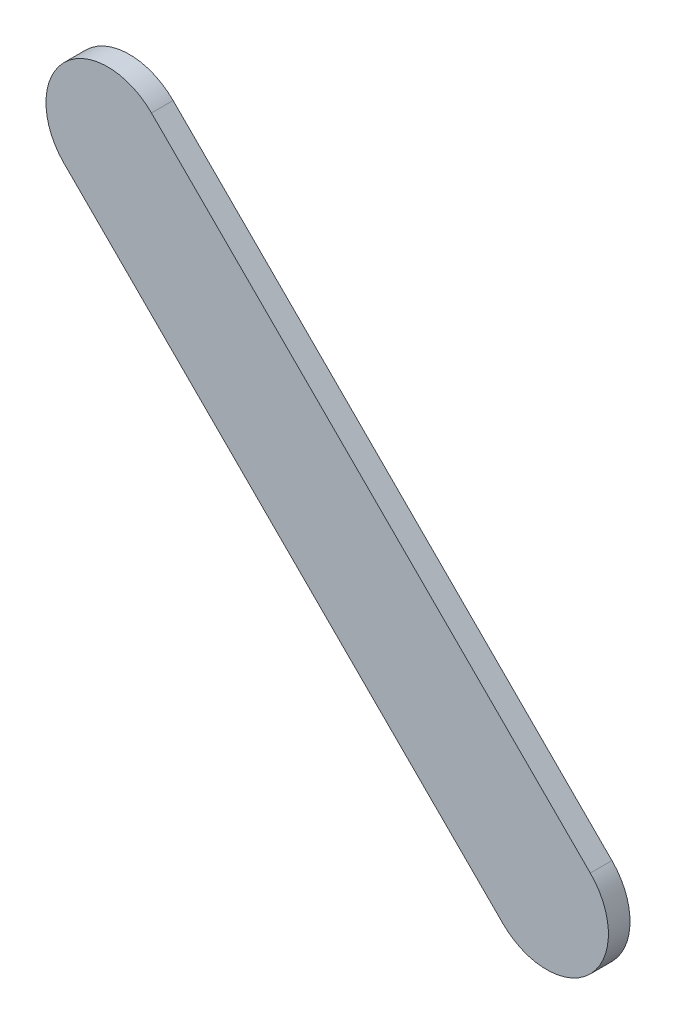
ISO-10303-21;
HEADER;
FILE_DESCRIPTION(('STEP AP214'),'2;1');
FILE_NAME('part.step','',(''),(''),'','','');
FILE_SCHEMA(('AUTOMOTIVE_DESIGN { 1 0 10303 214 1 1 1 1 }'));
ENDSEC;
DATA;
#1=APPLICATION_CONTEXT('core data for automotive mechanical design processes');
#2=APPLICATION_PROTOCOL_DEFINITION('international standard','automotive_design',2000,#1);
#3=PRODUCT_CONTEXT('',#1,'mechanical');
#4=PRODUCT('Part','Part','',(#3));
#5=PRODUCT_RELATED_PRODUCT_CATEGORY('part','',(#4));
#6=PRODUCT_DEFINITION_FORMATION('','',#4);
#7=PRODUCT_DEFINITION_CONTEXT('part definition',#1,'design');
#8=PRODUCT_DEFINITION('design','',#6,#7);
#9=PRODUCT_DEFINITION_SHAPE('','',#8);
#10=(LENGTH_UNIT() NAMED_UNIT(*) SI_UNIT(.MILLI.,.METRE.));
#11=(NAMED_UNIT(*) PLANE_ANGLE_UNIT() SI_UNIT($,.RADIAN.));
#12=(NAMED_UNIT(*) SI_UNIT($,.STERADIAN.) SOLID_ANGLE_UNIT());
#13=UNCERTAINTY_MEASURE_WITH_UNIT(LENGTH_MEASURE(1.E-05),#10,'distance_accuracy_value','');
#14=(GEOMETRIC_REPRESENTATION_CONTEXT(3) GLOBAL_UNCERTAINTY_ASSIGNED_CONTEXT((#13)) GLOBAL_UNIT_ASSIGNED_CONTEXT((#10,
#11,#12)) REPRESENTATION_CONTEXT('',''));
#15=CARTESIAN_POINT('',(0.,0.,0.));
#16=DIRECTION('',(0.,0.,1.));
#17=DIRECTION('',(1.,0.,0.));
#18=AXIS2_PLACEMENT_3D('',#15,#16,#17);
#19=CARTESIAN_POINT('',(80.069289,-109.76071,1.635));
#20=DIRECTION('',(0.,0.,1.));
#21=DIRECTION('',(1.,0.,0.));
#22=AXIS2_PLACEMENT_3D('',#19,#20,#21);
#23=PLANE('',#22);
#24=DIRECTION('',(0.707106781186548,-0.707106781186548,0.));
#25=VECTOR('',#24,1.);
#26=CARTESIAN_POINT('',(80.069289,-109.76071,1.635));
#27=LINE('',#26,#25);
#28=CARTESIAN_POINT('',(80.069289,-109.76071,1.635));
#29=VERTEX_POINT('',#28);
#30=CARTESIAN_POINT('',(80.779289,-110.47071,1.635));
#31=VERTEX_POINT('',#30);
#32=EDGE_CURVE('E69',#29,#31,#27,.T.);
#33=ORIENTED_EDGE('',*,*,#32,.T.);
#34=CARTESIAN_POINT('',(80.8499995,-110.3999995,1.635));
#35=DIRECTION('',(0.,0.,1.));
#36=DIRECTION('',(-0.707106781186548,-0.707106781186548,0.));
#37=AXIS2_PLACEMENT_3D('',#34,#35,#36);
#38=CIRCLE('',#37,0.09999974810218);
#39=CARTESIAN_POINT('',(80.92071,-110.329289,1.635));
#40=VERTEX_POINT('',#39);
#41=EDGE_CURVE('E94',#31,#40,#38,.T.);
#42=ORIENTED_EDGE('',*,*,#41,.T.);
#43=DIRECTION('',(-0.707106781186548,0.707106781186548,0.));
#44=VECTOR('',#43,1.);
#45=CARTESIAN_POINT('',(80.92071,-110.329289,1.635));
#46=LINE('',#45,#44);
#47=CARTESIAN_POINT('',(80.21071,-109.619289,1.635));
#48=VERTEX_POINT('',#47);
#49=EDGE_CURVE('E71',#40,#48,#46,.T.);
#50=ORIENTED_EDGE('',*,*,#49,.T.);
#51=CARTESIAN_POINT('',(80.1399995,-109.6899995,1.635));
#52=DIRECTION('',(0.,0.,1.));
#53=DIRECTION('',(0.707106781186548,0.707106781186548,0.));
#54=AXIS2_PLACEMENT_3D('',#51,#52,#53);
#55=CIRCLE('',#54,0.09999974810219);
#56=EDGE_CURVE('E11',#48,#29,#55,.T.);
#57=ORIENTED_EDGE('',*,*,#56,.T.);
#58=EDGE_LOOP('',(#33,#42,#50,#57));
#59=FACE_BOUND('',#58,.T.);
#60=ADVANCED_FACE('F17',(#59),#23,.T.);
#61=CARTESIAN_POINT('',(80.069289,-109.76071,1.6));
#62=DIRECTION('',(0.,0.,1.));
#63=DIRECTION('',(1.,0.,0.));
#64=AXIS2_PLACEMENT_3D('',#61,#62,#63);
#65=PLANE('',#64);
#66=CARTESIAN_POINT('',(80.1399995,-109.6899995,1.6));
#67=DIRECTION('',(0.,0.,1.));
#68=DIRECTION('',(0.707106781186548,0.707106781186548,0.));
#69=AXIS2_PLACEMENT_3D('',#66,#67,#68);
#70=CIRCLE('',#69,0.09999974810219);
#71=CARTESIAN_POINT('',(80.21071,-109.619289,1.6));
#72=VERTEX_POINT('',#71);
#73=CARTESIAN_POINT('',(80.069289,-109.76071,1.6));
#74=VERTEX_POINT('',#73);
#75=EDGE_CURVE('E25',#72,#74,#70,.T.);
#76=ORIENTED_EDGE('',*,*,#75,.F.);
#77=DIRECTION('',(-0.707106781186548,0.707106781186548,0.));
#78=VECTOR('',#77,1.);
#79=CARTESIAN_POINT('',(80.92071,-110.329289,1.6));
#80=LINE('',#79,#78);
#81=CARTESIAN_POINT('',(80.92071,-110.329289,1.6));
#82=VERTEX_POINT('',#81);
#83=EDGE_CURVE('E102',#82,#72,#80,.T.);
#84=ORIENTED_EDGE('',*,*,#83,.F.);
#85=CARTESIAN_POINT('',(80.8499995,-110.3999995,1.6));
#86=DIRECTION('',(0.,0.,1.));
#87=DIRECTION('',(-0.707106781186548,-0.707106781186548,0.));
#88=AXIS2_PLACEMENT_3D('',#85,#86,#87);
#89=CIRCLE('',#88,0.09999974810218);
#90=CARTESIAN_POINT('',(80.779289,-110.47071,1.6));
#91=VERTEX_POINT('',#90);
#92=EDGE_CURVE('E79',#91,#82,#89,.T.);
#93=ORIENTED_EDGE('',*,*,#92,.F.);
#94=DIRECTION('',(0.707106781186548,-0.707106781186548,0.));
#95=VECTOR('',#94,1.);
#96=CARTESIAN_POINT('',(80.069289,-109.76071,1.6));
#97=LINE('',#96,#95);
#98=EDGE_CURVE('E90',#74,#91,#97,.T.);
#99=ORIENTED_EDGE('',*,*,#98,.F.);
#100=EDGE_LOOP('',(#76,#84,#93,#99));
#101=FACE_BOUND('',#100,.T.);
#102=ADVANCED_FACE('F119',(#101),#65,.F.);
#103=CARTESIAN_POINT('',(80.1399995,-109.6899995,1.6));
#104=DIRECTION('',(0.,0.,-1.));
#105=DIRECTION('',(0.707106781186548,0.707106781186548,0.));
#106=AXIS2_PLACEMENT_3D('',#103,#104,#105);
#107=CYLINDRICAL_SURFACE('',#106,0.09999974810219);
#108=ORIENTED_EDGE('',*,*,#75,.T.);
#109=DIRECTION('',(0.,0.,1.));
#110=VECTOR('',#109,1.);
#111=CARTESIAN_POINT('',(80.069289,-109.76071,1.6));
#112=LINE('',#111,#110);
#113=EDGE_CURVE('E74',#74,#29,#112,.T.);
#114=ORIENTED_EDGE('',*,*,#113,.T.);
#115=ORIENTED_EDGE('',*,*,#56,.F.);
#116=DIRECTION('',(0.,0.,1.));
#117=VECTOR('',#116,1.);
#118=CARTESIAN_POINT('',(80.21071,-109.619289,1.6));
#119=LINE('',#118,#117);
#120=EDGE_CURVE('E106',#72,#48,#119,.T.);
#121=ORIENTED_EDGE('',*,*,#120,.F.);
#122=EDGE_LOOP('',(#108,#114,#115,#121));
#123=FACE_BOUND('',#122,.T.);
#124=ADVANCED_FACE('F75',(#123),#107,.T.);
#125=CARTESIAN_POINT('',(80.92071,-110.329289,1.6));
#126=DIRECTION('',(-0.707106781186548,-0.707106781186548,0.));
#127=DIRECTION('',(-0.707106781186548,0.707106781186548,0.));
#128=AXIS2_PLACEMENT_3D('',#125,#126,#127);
#129=PLANE('',#128);
#130=ORIENTED_EDGE('',*,*,#83,.T.);
#131=ORIENTED_EDGE('',*,*,#120,.T.);
#132=ORIENTED_EDGE('',*,*,#49,.F.);
#133=DIRECTION('',(0.,0.,1.));
#134=VECTOR('',#133,1.);
#135=CARTESIAN_POINT('',(80.92071,-110.329289,1.6));
#136=LINE('',#135,#134);
#137=EDGE_CURVE('E98',#82,#40,#136,.T.);
#138=ORIENTED_EDGE('',*,*,#137,.F.);
#139=EDGE_LOOP('',(#130,#131,#132,#138));
#140=FACE_BOUND('',#139,.T.);
#141=ADVANCED_FACE('F176',(#140),#129,.F.);
#142=CARTESIAN_POINT('',(80.8499995,-110.3999995,1.6));
#143=DIRECTION('',(0.,0.,-1.));
#144=DIRECTION('',(-0.707106781186548,-0.707106781186548,0.));
#145=AXIS2_PLACEMENT_3D('',#142,#143,#144);
#146=CYLINDRICAL_SURFACE('',#145,0.09999974810218);
#147=ORIENTED_EDGE('',*,*,#92,.T.);
#148=ORIENTED_EDGE('',*,*,#137,.T.);
#149=ORIENTED_EDGE('',*,*,#41,.F.);
#150=DIRECTION('',(0.,0.,1.));
#151=VECTOR('',#150,1.);
#152=CARTESIAN_POINT('',(80.779289,-110.47071,1.6));
#153=LINE('',#152,#151);
#154=EDGE_CURVE('E83',#91,#31,#153,.T.);
#155=ORIENTED_EDGE('',*,*,#154,.F.);
#156=EDGE_LOOP('',(#147,#148,#149,#155));
#157=FACE_BOUND('',#156,.T.);
#158=ADVANCED_FACE('F122',(#157),#146,.T.);
#159=CARTESIAN_POINT('',(80.069289,-109.76071,1.6));
#160=DIRECTION('',(0.707106781186548,0.707106781186548,0.));
#161=DIRECTION('',(0.,0.,-1.));
#162=AXIS2_PLACEMENT_3D('',#159,#160,#161);
#163=PLANE('',#162);
#164=ORIENTED_EDGE('',*,*,#98,.T.);
#165=ORIENTED_EDGE('',*,*,#154,.T.);
#166=ORIENTED_EDGE('',*,*,#32,.F.);
#167=ORIENTED_EDGE('',*,*,#113,.F.);
#168=EDGE_LOOP('',(#164,#165,#166,#167));
#169=FACE_BOUND('',#168,.T.);
#170=ADVANCED_FACE('F81',(#169),#163,.F.);
#171=CLOSED_SHELL('',(#60,#102,#124,#141,#158,#170));
#172=MANIFOLD_SOLID_BREP('B1',#171);
#173=ADVANCED_BREP_SHAPE_REPRESENTATION('',(#18,#172),#14);
#174=SHAPE_DEFINITION_REPRESENTATION(#9,#173);
ENDSEC;
END-ISO-10303-21;
